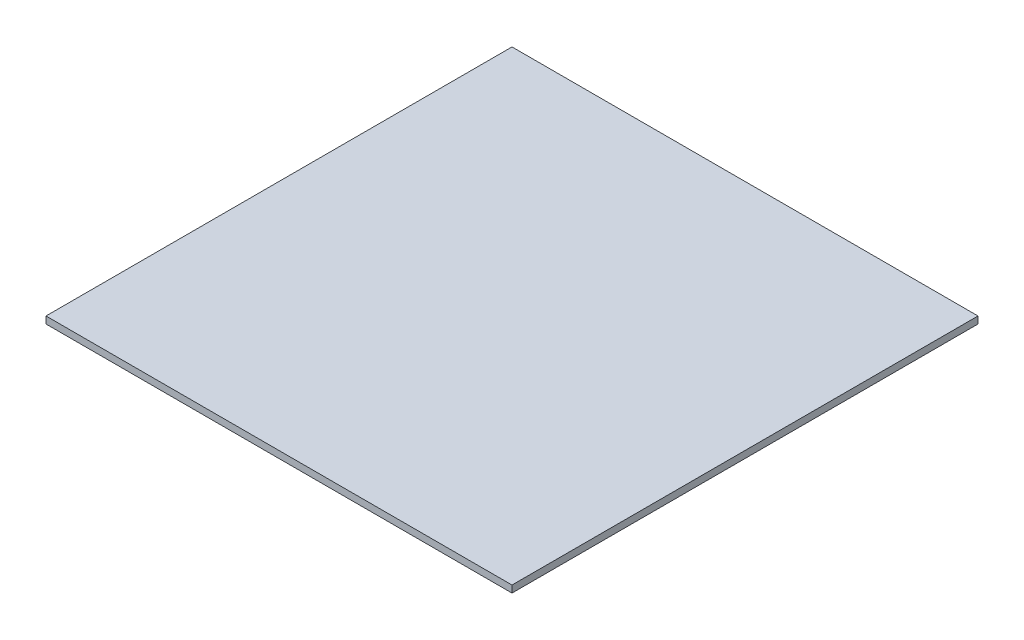
ISO-10303-21;
HEADER;
FILE_DESCRIPTION(('STEP AP214'),'2;1');
FILE_NAME('part.step','',(''),(''),'','','');
FILE_SCHEMA(('AUTOMOTIVE_DESIGN { 1 0 10303 214 1 1 1 1 }'));
ENDSEC;
DATA;
#1=APPLICATION_CONTEXT('core data for automotive mechanical design processes');
#2=APPLICATION_PROTOCOL_DEFINITION('international standard','automotive_design',2000,#1);
#3=PRODUCT_CONTEXT('',#1,'mechanical');
#4=PRODUCT('Part','Part','',(#3));
#5=PRODUCT_RELATED_PRODUCT_CATEGORY('part','',(#4));
#6=PRODUCT_DEFINITION_FORMATION('','',#4);
#7=PRODUCT_DEFINITION_CONTEXT('part definition',#1,'design');
#8=PRODUCT_DEFINITION('design','',#6,#7);
#9=PRODUCT_DEFINITION_SHAPE('','',#8);
#10=(LENGTH_UNIT() NAMED_UNIT(*) SI_UNIT(.MILLI.,.METRE.));
#11=(NAMED_UNIT(*) PLANE_ANGLE_UNIT() SI_UNIT($,.RADIAN.));
#12=(NAMED_UNIT(*) SI_UNIT($,.STERADIAN.) SOLID_ANGLE_UNIT());
#13=UNCERTAINTY_MEASURE_WITH_UNIT(LENGTH_MEASURE(1.E-05),#10,'distance_accuracy_value','');
#14=(GEOMETRIC_REPRESENTATION_CONTEXT(3) GLOBAL_UNCERTAINTY_ASSIGNED_CONTEXT((#13)) GLOBAL_UNIT_ASSIGNED_CONTEXT((#10,
#11,#12)) REPRESENTATION_CONTEXT('',''));
#15=CARTESIAN_POINT('',(0.,0.,0.));
#16=DIRECTION('',(0.,0.,1.));
#17=DIRECTION('',(1.,0.,0.));
#18=AXIS2_PLACEMENT_3D('',#15,#16,#17);
#19=CARTESIAN_POINT('',(50.,1.5,50.));
#20=DIRECTION('',(-1.,0.,0.));
#21=DIRECTION('',(0.,0.,1.));
#22=AXIS2_PLACEMENT_3D('',#19,#20,#21);
#23=PLANE('',#22);
#24=DIRECTION('',(0.,0.,-1.));
#25=VECTOR('',#24,1.);
#26=CARTESIAN_POINT('',(50.,0.,50.));
#27=LINE('',#26,#25);
#28=CARTESIAN_POINT('',(50.,0.,50.));
#29=VERTEX_POINT('',#28);
#30=CARTESIAN_POINT('',(50.,0.,-50.));
#31=VERTEX_POINT('',#30);
#32=EDGE_CURVE('E96',#29,#31,#27,.T.);
#33=ORIENTED_EDGE('',*,*,#32,.T.);
#34=DIRECTION('',(0.,-1.,0.));
#35=VECTOR('',#34,1.);
#36=CARTESIAN_POINT('',(50.,1.5,-50.));
#37=LINE('',#36,#35);
#38=CARTESIAN_POINT('',(50.,1.5,-50.));
#39=VERTEX_POINT('',#38);
#40=EDGE_CURVE('E11',#39,#31,#37,.T.);
#41=ORIENTED_EDGE('',*,*,#40,.F.);
#42=DIRECTION('',(0.,0.,-1.));
#43=VECTOR('',#42,1.);
#44=CARTESIAN_POINT('',(50.,1.5,50.));
#45=LINE('',#44,#43);
#46=CARTESIAN_POINT('',(50.,1.5,50.));
#47=VERTEX_POINT('',#46);
#48=EDGE_CURVE('E84',#47,#39,#45,.T.);
#49=ORIENTED_EDGE('',*,*,#48,.F.);
#50=DIRECTION('',(0.,-1.,0.));
#51=VECTOR('',#50,1.);
#52=CARTESIAN_POINT('',(50.,1.5,50.));
#53=LINE('',#52,#51);
#54=EDGE_CURVE('E92',#47,#29,#53,.T.);
#55=ORIENTED_EDGE('',*,*,#54,.T.);
#56=EDGE_LOOP('',(#33,#41,#49,#55));
#57=FACE_BOUND('',#56,.T.);
#58=ADVANCED_FACE('F33',(#57),#23,.F.);
#59=CARTESIAN_POINT('',(-50.,1.5,-50.));
#60=DIRECTION('',(0.,0.,1.));
#61=DIRECTION('',(1.,0.,0.));
#62=AXIS2_PLACEMENT_3D('',#59,#60,#61);
#63=PLANE('',#62);
#64=DIRECTION('',(-1.,0.,0.));
#65=VECTOR('',#64,1.);
#66=CARTESIAN_POINT('',(-50.,0.,-50.));
#67=LINE('',#66,#65);
#68=CARTESIAN_POINT('',(-50.,0.,-50.));
#69=VERTEX_POINT('',#68);
#70=EDGE_CURVE('E88',#31,#69,#67,.T.);
#71=ORIENTED_EDGE('',*,*,#70,.T.);
#72=DIRECTION('',(0.,-1.,0.));
#73=VECTOR('',#72,1.);
#74=CARTESIAN_POINT('',(-50.,1.5,-50.));
#75=LINE('',#74,#73);
#76=CARTESIAN_POINT('',(-50.,1.5,-50.));
#77=VERTEX_POINT('',#76);
#78=EDGE_CURVE('E41',#77,#69,#75,.T.);
#79=ORIENTED_EDGE('',*,*,#78,.F.);
#80=DIRECTION('',(-1.,0.,0.));
#81=VECTOR('',#80,1.);
#82=CARTESIAN_POINT('',(-50.,1.5,-50.));
#83=LINE('',#82,#81);
#84=EDGE_CURVE('E79',#39,#77,#83,.T.);
#85=ORIENTED_EDGE('',*,*,#84,.F.);
#86=ORIENTED_EDGE('',*,*,#40,.T.);
#87=EDGE_LOOP('',(#71,#79,#85,#86));
#88=FACE_BOUND('',#87,.T.);
#89=ADVANCED_FACE('F87',(#88),#63,.F.);
#90=CARTESIAN_POINT('',(-50.,1.5,50.));
#91=DIRECTION('',(1.,0.,0.));
#92=DIRECTION('',(0.,0.,-1.));
#93=AXIS2_PLACEMENT_3D('',#90,#91,#92);
#94=PLANE('',#93);
#95=DIRECTION('',(0.,0.,1.));
#96=VECTOR('',#95,1.);
#97=CARTESIAN_POINT('',(-50.,0.,50.));
#98=LINE('',#97,#96);
#99=CARTESIAN_POINT('',(-50.,0.,50.));
#100=VERTEX_POINT('',#99);
#101=EDGE_CURVE('E66',#69,#100,#98,.T.);
#102=ORIENTED_EDGE('',*,*,#101,.T.);
#103=DIRECTION('',(0.,-1.,0.));
#104=VECTOR('',#103,1.);
#105=CARTESIAN_POINT('',(-50.,1.5,50.));
#106=LINE('',#105,#104);
#107=CARTESIAN_POINT('',(-50.,1.5,50.));
#108=VERTEX_POINT('',#107);
#109=EDGE_CURVE('E89',#108,#100,#106,.T.);
#110=ORIENTED_EDGE('',*,*,#109,.F.);
#111=DIRECTION('',(0.,0.,1.));
#112=VECTOR('',#111,1.);
#113=CARTESIAN_POINT('',(-50.,1.5,50.));
#114=LINE('',#113,#112);
#115=EDGE_CURVE('E82',#77,#108,#114,.T.);
#116=ORIENTED_EDGE('',*,*,#115,.F.);
#117=ORIENTED_EDGE('',*,*,#78,.T.);
#118=EDGE_LOOP('',(#102,#110,#116,#117));
#119=FACE_BOUND('',#118,.T.);
#120=ADVANCED_FACE('F90',(#119),#94,.F.);
#121=CARTESIAN_POINT('',(-50.,1.5,50.));
#122=DIRECTION('',(0.,0.,-1.));
#123=DIRECTION('',(-1.,0.,0.));
#124=AXIS2_PLACEMENT_3D('',#121,#122,#123);
#125=PLANE('',#124);
#126=DIRECTION('',(1.,0.,0.));
#127=VECTOR('',#126,1.);
#128=CARTESIAN_POINT('',(-50.,0.,50.));
#129=LINE('',#128,#127);
#130=EDGE_CURVE('E72',#100,#29,#129,.T.);
#131=ORIENTED_EDGE('',*,*,#130,.T.);
#132=ORIENTED_EDGE('',*,*,#54,.F.);
#133=DIRECTION('',(1.,0.,0.));
#134=VECTOR('',#133,1.);
#135=CARTESIAN_POINT('',(-50.,1.5,50.));
#136=LINE('',#135,#134);
#137=EDGE_CURVE('E49',#108,#47,#136,.T.);
#138=ORIENTED_EDGE('',*,*,#137,.F.);
#139=ORIENTED_EDGE('',*,*,#109,.T.);
#140=EDGE_LOOP('',(#131,#132,#138,#139));
#141=FACE_BOUND('',#140,.T.);
#142=ADVANCED_FACE('F103',(#141),#125,.F.);
#143=CARTESIAN_POINT('',(0.,1.5,0.));
#144=DIRECTION('',(0.,-1.,0.));
#145=DIRECTION('',(0.,0.,-1.));
#146=AXIS2_PLACEMENT_3D('',#143,#144,#145);
#147=PLANE('',#146);
#148=ORIENTED_EDGE('',*,*,#48,.T.);
#149=ORIENTED_EDGE('',*,*,#84,.T.);
#150=ORIENTED_EDGE('',*,*,#115,.T.);
#151=ORIENTED_EDGE('',*,*,#137,.T.);
#152=EDGE_LOOP('',(#148,#149,#150,#151));
#153=FACE_BOUND('',#152,.T.);
#154=ADVANCED_FACE('F80',(#153),#147,.F.);
#155=CARTESIAN_POINT('',(0.,0.,0.));
#156=DIRECTION('',(0.,-1.,0.));
#157=DIRECTION('',(0.,0.,-1.));
#158=AXIS2_PLACEMENT_3D('',#155,#156,#157);
#159=PLANE('',#158);
#160=ORIENTED_EDGE('',*,*,#32,.F.);
#161=ORIENTED_EDGE('',*,*,#130,.F.);
#162=ORIENTED_EDGE('',*,*,#101,.F.);
#163=ORIENTED_EDGE('',*,*,#70,.F.);
#164=EDGE_LOOP('',(#160,#161,#162,#163));
#165=FACE_BOUND('',#164,.T.);
#166=ADVANCED_FACE('F106',(#165),#159,.T.);
#167=CLOSED_SHELL('',(#58,#89,#120,#142,#154,#166));
#168=MANIFOLD_SOLID_BREP('B2',#167);
#169=ADVANCED_BREP_SHAPE_REPRESENTATION('',(#18,#168),#14);
#170=SHAPE_DEFINITION_REPRESENTATION(#9,#169);
ENDSEC;
END-ISO-10303-21;
